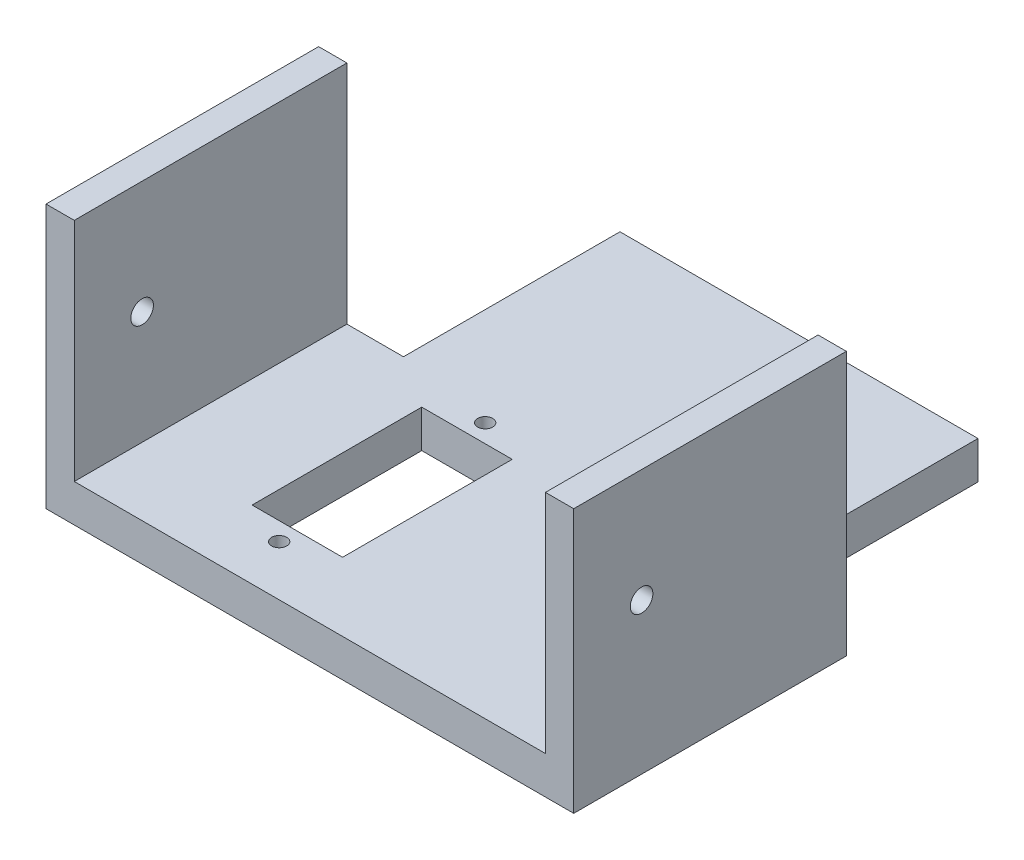
ISO-10303-21;
HEADER;
FILE_DESCRIPTION(('STEP AP214'),'2;1');
FILE_NAME('part.step','',(''),(''),'','','');
FILE_SCHEMA(('AUTOMOTIVE_DESIGN { 1 0 10303 214 1 1 1 1 }'));
ENDSEC;
DATA;
#1=APPLICATION_CONTEXT('core data for automotive mechanical design processes');
#2=APPLICATION_PROTOCOL_DEFINITION('international standard','automotive_design',2000,#1);
#3=PRODUCT_CONTEXT('',#1,'mechanical');
#4=PRODUCT('Part','Part','',(#3));
#5=PRODUCT_RELATED_PRODUCT_CATEGORY('part','',(#4));
#6=PRODUCT_DEFINITION_FORMATION('','',#4);
#7=PRODUCT_DEFINITION_CONTEXT('part definition',#1,'design');
#8=PRODUCT_DEFINITION('design','',#6,#7);
#9=PRODUCT_DEFINITION_SHAPE('','',#8);
#10=(LENGTH_UNIT() NAMED_UNIT(*) SI_UNIT(.MILLI.,.METRE.));
#11=(NAMED_UNIT(*) PLANE_ANGLE_UNIT() SI_UNIT($,.RADIAN.));
#12=(NAMED_UNIT(*) SI_UNIT($,.STERADIAN.) SOLID_ANGLE_UNIT());
#13=UNCERTAINTY_MEASURE_WITH_UNIT(LENGTH_MEASURE(1.E-05),#10,'distance_accuracy_value','');
#14=(GEOMETRIC_REPRESENTATION_CONTEXT(3) GLOBAL_UNCERTAINTY_ASSIGNED_CONTEXT((#13)) GLOBAL_UNIT_ASSIGNED_CONTEXT((#10,
#11,#12)) REPRESENTATION_CONTEXT('',''));
#15=CARTESIAN_POINT('',(0.,0.,0.));
#16=DIRECTION('',(0.,0.,1.));
#17=DIRECTION('',(1.,0.,0.));
#18=AXIS2_PLACEMENT_3D('',#15,#16,#17);
#19=CARTESIAN_POINT('',(-35.,5.,-75.));
#20=DIRECTION('',(1.,0.,0.));
#21=DIRECTION('',(0.,0.,-1.));
#22=AXIS2_PLACEMENT_3D('',#19,#20,#21);
#23=PLANE('',#22);
#24=CARTESIAN_POINT('',(-35.,20.,6.));
#25=DIRECTION('',(-1.,0.,0.));
#26=DIRECTION('',(0.,0.,1.));
#27=AXIS2_PLACEMENT_3D('',#24,#25,#26);
#28=CIRCLE('',#27,1.5);
#29=CARTESIAN_POINT('',(-35.,20.,7.5));
#30=VERTEX_POINT('',#29);
#31=EDGE_CURVE('E242',#30,#30,#28,.T.);
#32=ORIENTED_EDGE('',*,*,#31,.F.);
#33=EDGE_LOOP('',(#32));
#34=FACE_BOUND('',#33,.T.);
#35=DIRECTION('',(0.,-1.,0.));
#36=VECTOR('',#35,1.);
#37=CARTESIAN_POINT('',(-35.,40.,-21.1622367915147));
#38=LINE('',#37,#36);
#39=CARTESIAN_POINT('',(-35.,35.,-21.1622367915147));
#40=VERTEX_POINT('',#39);
#41=CARTESIAN_POINT('',(-35.,0.,-21.1622367915147));
#42=VERTEX_POINT('',#41);
#43=EDGE_CURVE('E221',#40,#42,#38,.T.);
#44=ORIENTED_EDGE('',*,*,#43,.T.);
#45=DIRECTION('',(0.,0.,1.));
#46=VECTOR('',#45,1.);
#47=CARTESIAN_POINT('',(-35.,0.,-75.));
#48=LINE('',#47,#46);
#49=CARTESIAN_POINT('',(-35.,0.,15.));
#50=VERTEX_POINT('',#49);
#51=EDGE_CURVE('E292',#42,#50,#48,.T.);
#52=ORIENTED_EDGE('',*,*,#51,.T.);
#53=DIRECTION('',(0.,1.,0.));
#54=VECTOR('',#53,1.);
#55=CARTESIAN_POINT('',(-35.,5.,15.));
#56=LINE('',#55,#54);
#57=CARTESIAN_POINT('',(-35.,35.,15.));
#58=VERTEX_POINT('',#57);
#59=EDGE_CURVE('E269',#50,#58,#56,.T.);
#60=ORIENTED_EDGE('',*,*,#59,.T.);
#61=DIRECTION('',(0.,0.,-1.));
#62=VECTOR('',#61,1.);
#63=CARTESIAN_POINT('',(-35.,35.,15.));
#64=LINE('',#63,#62);
#65=EDGE_CURVE('E255',#58,#40,#64,.T.);
#66=ORIENTED_EDGE('',*,*,#65,.T.);
#67=EDGE_LOOP('',(#44,#52,#60,#66));
#68=FACE_BOUND('',#67,.T.);
#69=ADVANCED_FACE('F45',(#34,#68),#23,.F.);
#70=CARTESIAN_POINT('',(-31.25,5.,15.));
#71=DIRECTION('',(1.,0.,0.));
#72=DIRECTION('',(0.,0.,-1.));
#73=AXIS2_PLACEMENT_3D('',#70,#71,#72);
#74=PLANE('',#73);
#75=CARTESIAN_POINT('',(-31.25,20.,6.));
#76=DIRECTION('',(1.,0.,0.));
#77=DIRECTION('',(0.,0.,-1.));
#78=AXIS2_PLACEMENT_3D('',#75,#76,#77);
#79=CIRCLE('',#78,1.5);
#80=CARTESIAN_POINT('',(-31.25,20.,4.5));
#81=VERTEX_POINT('',#80);
#82=EDGE_CURVE('E245',#81,#81,#79,.T.);
#83=ORIENTED_EDGE('',*,*,#82,.F.);
#84=EDGE_LOOP('',(#83));
#85=FACE_BOUND('',#84,.T.);
#86=DIRECTION('',(0.,0.,-1.));
#87=VECTOR('',#86,1.);
#88=CARTESIAN_POINT('',(-31.25,5.,15.));
#89=LINE('',#88,#87);
#90=CARTESIAN_POINT('',(-31.25,5.,15.));
#91=VERTEX_POINT('',#90);
#92=CARTESIAN_POINT('',(-31.25,5.,-21.1622367915147));
#93=VERTEX_POINT('',#92);
#94=EDGE_CURVE('E254',#91,#93,#89,.T.);
#95=ORIENTED_EDGE('',*,*,#94,.T.);
#96=DIRECTION('',(0.,1.,0.));
#97=VECTOR('',#96,1.);
#98=CARTESIAN_POINT('',(-31.25,5.,-21.1622367915147));
#99=LINE('',#98,#97);
#100=CARTESIAN_POINT('',(-31.25,35.,-21.1622367915147));
#101=VERTEX_POINT('',#100);
#102=EDGE_CURVE('E216',#93,#101,#99,.T.);
#103=ORIENTED_EDGE('',*,*,#102,.T.);
#104=DIRECTION('',(0.,0.,-1.));
#105=VECTOR('',#104,1.);
#106=CARTESIAN_POINT('',(-31.25,35.,15.));
#107=LINE('',#106,#105);
#108=CARTESIAN_POINT('',(-31.25,35.,15.));
#109=VERTEX_POINT('',#108);
#110=EDGE_CURVE('E259',#109,#101,#107,.T.);
#111=ORIENTED_EDGE('',*,*,#110,.F.);
#112=DIRECTION('',(0.,-1.,0.));
#113=VECTOR('',#112,1.);
#114=CARTESIAN_POINT('',(-31.25,5.,15.));
#115=LINE('',#114,#113);
#116=EDGE_CURVE('E258',#109,#91,#115,.T.);
#117=ORIENTED_EDGE('',*,*,#116,.T.);
#118=EDGE_LOOP('',(#95,#103,#111,#117));
#119=FACE_BOUND('',#118,.T.);
#120=ADVANCED_FACE('F332',(#85,#119),#74,.T.);
#121=CARTESIAN_POINT('',(-35.,35.,15.));
#122=DIRECTION('',(0.,1.,0.));
#123=DIRECTION('',(0.,0.,1.));
#124=AXIS2_PLACEMENT_3D('',#121,#122,#123);
#125=PLANE('',#124);
#126=ORIENTED_EDGE('',*,*,#110,.T.);
#127=DIRECTION('',(-1.,0.,0.));
#128=VECTOR('',#127,1.);
#129=CARTESIAN_POINT('',(-35.,35.,-21.1622367915147));
#130=LINE('',#129,#128);
#131=EDGE_CURVE('E53',#101,#40,#130,.T.);
#132=ORIENTED_EDGE('',*,*,#131,.T.);
#133=ORIENTED_EDGE('',*,*,#65,.F.);
#134=DIRECTION('',(1.,0.,0.));
#135=VECTOR('',#134,1.);
#136=CARTESIAN_POINT('',(-35.,35.,15.));
#137=LINE('',#136,#135);
#138=EDGE_CURVE('E266',#58,#109,#137,.T.);
#139=ORIENTED_EDGE('',*,*,#138,.T.);
#140=EDGE_LOOP('',(#126,#132,#133,#139));
#141=FACE_BOUND('',#140,.T.);
#142=ADVANCED_FACE('F300',(#141),#125,.T.);
#143=CARTESIAN_POINT('',(0.,5.,0.));
#144=DIRECTION('',(0.,1.,0.));
#145=DIRECTION('',(0.,0.,1.));
#146=AXIS2_PLACEMENT_3D('',#143,#144,#145);
#147=PLANE('',#146);
#148=CARTESIAN_POINT('',(-10.75,5.,-19.));
#149=DIRECTION('',(0.,1.,0.));
#150=DIRECTION('',(0.,0.,1.));
#151=AXIS2_PLACEMENT_3D('',#148,#149,#150);
#152=CIRCLE('',#151,1.);
#153=CARTESIAN_POINT('',(-10.75,5.,-18.));
#154=VERTEX_POINT('',#153);
#155=EDGE_CURVE('E195',#154,#154,#152,.T.);
#156=ORIENTED_EDGE('',*,*,#155,.F.);
#157=EDGE_LOOP('',(#156));
#158=FACE_BOUND('',#157,.T.);
#159=CARTESIAN_POINT('',(-10.75,5.,8.32));
#160=DIRECTION('',(0.,1.,0.));
#161=DIRECTION('',(0.,0.,1.));
#162=AXIS2_PLACEMENT_3D('',#159,#160,#161);
#163=CIRCLE('',#162,0.999999999999999);
#164=CARTESIAN_POINT('',(-10.75,5.,9.32));
#165=VERTEX_POINT('',#164);
#166=EDGE_CURVE('E192',#165,#165,#163,.T.);
#167=ORIENTED_EDGE('',*,*,#166,.F.);
#168=EDGE_LOOP('',(#167));
#169=FACE_BOUND('',#168,.T.);
#170=DIRECTION('',(0.,0.,-1.));
#171=VECTOR('',#170,1.);
#172=CARTESIAN_POINT('',(-4.75,5.,0.));
#173=LINE('',#172,#171);
#174=CARTESIAN_POINT('',(-4.75,5.,5.91));
#175=VERTEX_POINT('',#174);
#176=CARTESIAN_POINT('',(-4.75,5.,-16.59));
#177=VERTEX_POINT('',#176);
#178=EDGE_CURVE('E190',#175,#177,#173,.T.);
#179=ORIENTED_EDGE('',*,*,#178,.F.);
#180=DIRECTION('',(1.,0.,0.));
#181=VECTOR('',#180,1.);
#182=CARTESIAN_POINT('',(0.,5.,5.91));
#183=LINE('',#182,#181);
#184=CARTESIAN_POINT('',(-16.75,5.,5.91));
#185=VERTEX_POINT('',#184);
#186=EDGE_CURVE('E183',#185,#175,#183,.T.);
#187=ORIENTED_EDGE('',*,*,#186,.F.);
#188=DIRECTION('',(0.,0.,1.));
#189=VECTOR('',#188,1.);
#190=CARTESIAN_POINT('',(-16.75,5.,0.));
#191=LINE('',#190,#189);
#192=CARTESIAN_POINT('',(-16.75,5.,-16.59));
#193=VERTEX_POINT('',#192);
#194=EDGE_CURVE('E163',#193,#185,#191,.T.);
#195=ORIENTED_EDGE('',*,*,#194,.F.);
#196=DIRECTION('',(-1.,0.,0.));
#197=VECTOR('',#196,1.);
#198=CARTESIAN_POINT('',(0.,5.,-16.59));
#199=LINE('',#198,#197);
#200=EDGE_CURVE('E188',#177,#193,#199,.T.);
#201=ORIENTED_EDGE('',*,*,#200,.F.);
#202=EDGE_LOOP('',(#179,#187,#195,#201));
#203=FACE_BOUND('',#202,.T.);
#204=DIRECTION('',(1.,0.,0.));
#205=VECTOR('',#204,1.);
#206=CARTESIAN_POINT('',(0.,5.,-21.1622367915147));
#207=LINE('',#206,#205);
#208=CARTESIAN_POINT('',(23.7454943399626,5.,-21.1622367915147));
#209=VERTEX_POINT('',#208);
#210=CARTESIAN_POINT('',(31.25,5.,-21.1622367915147));
#211=VERTEX_POINT('',#210);
#212=EDGE_CURVE('E234',#209,#211,#207,.T.);
#213=ORIENTED_EDGE('',*,*,#212,.F.);
#214=DIRECTION('',(0.,0.,1.));
#215=VECTOR('',#214,1.);
#216=CARTESIAN_POINT('',(23.7454943399626,5.,0.));
#217=LINE('',#216,#215);
#218=CARTESIAN_POINT('',(23.7454943399626,5.,-49.8787477241933));
#219=VERTEX_POINT('',#218);
#220=EDGE_CURVE('E238',#219,#209,#217,.T.);
#221=ORIENTED_EDGE('',*,*,#220,.F.);
#222=DIRECTION('',(1.,0.,0.));
#223=VECTOR('',#222,1.);
#224=CARTESIAN_POINT('',(0.,5.,-49.8787477241933));
#225=LINE('',#224,#223);
#226=CARTESIAN_POINT('',(-23.7454943399626,5.,-49.8787477241933));
#227=VERTEX_POINT('',#226);
#228=EDGE_CURVE('E240',#227,#219,#225,.T.);
#229=ORIENTED_EDGE('',*,*,#228,.F.);
#230=DIRECTION('',(0.,0.,-1.));
#231=VECTOR('',#230,1.);
#232=CARTESIAN_POINT('',(-23.7454943399626,5.,0.));
#233=LINE('',#232,#231);
#234=CARTESIAN_POINT('',(-23.7454943399626,5.,-21.1622367915147));
#235=VERTEX_POINT('',#234);
#236=EDGE_CURVE('E236',#235,#227,#233,.T.);
#237=ORIENTED_EDGE('',*,*,#236,.F.);
#238=DIRECTION('',(-1.,0.,0.));
#239=VECTOR('',#238,1.);
#240=CARTESIAN_POINT('',(0.,5.,-21.1622367915147));
#241=LINE('',#240,#239);
#242=EDGE_CURVE('E229',#235,#93,#241,.T.);
#243=ORIENTED_EDGE('',*,*,#242,.T.);
#244=ORIENTED_EDGE('',*,*,#94,.F.);
#245=DIRECTION('',(1.,0.,0.));
#246=VECTOR('',#245,1.);
#247=CARTESIAN_POINT('',(-40.,5.,15.));
#248=LINE('',#247,#246);
#249=CARTESIAN_POINT('',(31.25,5.,15.));
#250=VERTEX_POINT('',#249);
#251=EDGE_CURVE('E252',#91,#250,#248,.T.);
#252=ORIENTED_EDGE('',*,*,#251,.T.);
#253=DIRECTION('',(0.,0.,-1.));
#254=VECTOR('',#253,1.);
#255=CARTESIAN_POINT('',(31.25,5.,15.));
#256=LINE('',#255,#254);
#257=EDGE_CURVE('E280',#250,#211,#256,.T.);
#258=ORIENTED_EDGE('',*,*,#257,.T.);
#259=EDGE_LOOP('',(#213,#221,#229,#237,#243,#244,#252,#258));
#260=FACE_BOUND('',#259,.T.);
#261=ADVANCED_FACE('F329',(#158,#169,#203,#260),#147,.T.);
#262=CARTESIAN_POINT('',(35.,5.,-75.));
#263=DIRECTION('',(-1.,0.,0.));
#264=DIRECTION('',(0.,0.,1.));
#265=AXIS2_PLACEMENT_3D('',#262,#263,#264);
#266=PLANE('',#265);
#267=CARTESIAN_POINT('',(35.,20.,5.99999999999999));
#268=DIRECTION('',(-1.,0.,0.));
#269=DIRECTION('',(0.,0.,1.));
#270=AXIS2_PLACEMENT_3D('',#267,#268,#269);
#271=CIRCLE('',#270,1.5);
#272=CARTESIAN_POINT('',(35.,20.,7.49999999999999));
#273=VERTEX_POINT('',#272);
#274=EDGE_CURVE('E249',#273,#273,#271,.T.);
#275=ORIENTED_EDGE('',*,*,#274,.T.);
#276=EDGE_LOOP('',(#275));
#277=FACE_BOUND('',#276,.T.);
#278=DIRECTION('',(0.,0.,-1.));
#279=VECTOR('',#278,1.);
#280=CARTESIAN_POINT('',(35.,0.,-75.));
#281=LINE('',#280,#279);
#282=CARTESIAN_POINT('',(35.,0.,15.));
#283=VERTEX_POINT('',#282);
#284=CARTESIAN_POINT('',(35.,0.,-21.1622367915147));
#285=VERTEX_POINT('',#284);
#286=EDGE_CURVE('E284',#283,#285,#281,.T.);
#287=ORIENTED_EDGE('',*,*,#286,.T.);
#288=DIRECTION('',(0.,-1.,0.));
#289=VECTOR('',#288,1.);
#290=CARTESIAN_POINT('',(35.,40.,-21.1622367915147));
#291=LINE('',#290,#289);
#292=CARTESIAN_POINT('',(35.,35.,-21.1622367915147));
#293=VERTEX_POINT('',#292);
#294=EDGE_CURVE('E219',#293,#285,#291,.T.);
#295=ORIENTED_EDGE('',*,*,#294,.F.);
#296=DIRECTION('',(0.,0.,-1.));
#297=VECTOR('',#296,1.);
#298=CARTESIAN_POINT('',(35.,35.,15.));
#299=LINE('',#298,#297);
#300=CARTESIAN_POINT('',(35.,35.,15.));
#301=VERTEX_POINT('',#300);
#302=EDGE_CURVE('E281',#301,#293,#299,.T.);
#303=ORIENTED_EDGE('',*,*,#302,.F.);
#304=DIRECTION('',(0.,-1.,0.));
#305=VECTOR('',#304,1.);
#306=CARTESIAN_POINT('',(35.,5.,15.));
#307=LINE('',#306,#305);
#308=EDGE_CURVE('E272',#301,#283,#307,.T.);
#309=ORIENTED_EDGE('',*,*,#308,.T.);
#310=EDGE_LOOP('',(#287,#295,#303,#309));
#311=FACE_BOUND('',#310,.T.);
#312=ADVANCED_FACE('F47',(#277,#311),#266,.F.);
#313=CARTESIAN_POINT('',(0.,0.,0.));
#314=DIRECTION('',(0.,1.,0.));
#315=DIRECTION('',(0.,0.,1.));
#316=AXIS2_PLACEMENT_3D('',#313,#314,#315);
#317=PLANE('',#316);
#318=CARTESIAN_POINT('',(-10.75,0.,-19.));
#319=DIRECTION('',(0.,-1.,0.));
#320=DIRECTION('',(0.,0.,-1.));
#321=AXIS2_PLACEMENT_3D('',#318,#319,#320);
#322=CIRCLE('',#321,1.);
#323=CARTESIAN_POINT('',(-10.75,0.,-20.));
#324=VERTEX_POINT('',#323);
#325=EDGE_CURVE('E421',#324,#324,#322,.T.);
#326=ORIENTED_EDGE('',*,*,#325,.F.);
#327=EDGE_LOOP('',(#326));
#328=FACE_BOUND('',#327,.T.);
#329=CARTESIAN_POINT('',(-10.75,0.,8.32));
#330=DIRECTION('',(0.,-1.,0.));
#331=DIRECTION('',(0.,0.,-1.));
#332=AXIS2_PLACEMENT_3D('',#329,#330,#331);
#333=CIRCLE('',#332,0.999999999999999);
#334=CARTESIAN_POINT('',(-10.75,0.,7.32));
#335=VERTEX_POINT('',#334);
#336=EDGE_CURVE('E419',#335,#335,#333,.T.);
#337=ORIENTED_EDGE('',*,*,#336,.F.);
#338=EDGE_LOOP('',(#337));
#339=FACE_BOUND('',#338,.T.);
#340=DIRECTION('',(-1.,0.,0.));
#341=VECTOR('',#340,1.);
#342=CARTESIAN_POINT('',(-16.75,0.,5.91));
#343=LINE('',#342,#341);
#344=CARTESIAN_POINT('',(-4.75,0.,5.91));
#345=VERTEX_POINT('',#344);
#346=CARTESIAN_POINT('',(-16.75,0.,5.91));
#347=VERTEX_POINT('',#346);
#348=EDGE_CURVE('E169',#345,#347,#343,.T.);
#349=ORIENTED_EDGE('',*,*,#348,.F.);
#350=DIRECTION('',(0.,0.,1.));
#351=VECTOR('',#350,1.);
#352=CARTESIAN_POINT('',(-4.75,0.,5.91));
#353=LINE('',#352,#351);
#354=CARTESIAN_POINT('',(-4.75,0.,-16.59));
#355=VERTEX_POINT('',#354);
#356=EDGE_CURVE('E68',#355,#345,#353,.T.);
#357=ORIENTED_EDGE('',*,*,#356,.F.);
#358=DIRECTION('',(1.,0.,0.));
#359=VECTOR('',#358,1.);
#360=CARTESIAN_POINT('',(-16.75,0.,-16.59));
#361=LINE('',#360,#359);
#362=CARTESIAN_POINT('',(-16.75,0.,-16.59));
#363=VERTEX_POINT('',#362);
#364=EDGE_CURVE('E176',#363,#355,#361,.T.);
#365=ORIENTED_EDGE('',*,*,#364,.F.);
#366=DIRECTION('',(0.,0.,-1.));
#367=VECTOR('',#366,1.);
#368=CARTESIAN_POINT('',(-16.75,0.,5.91));
#369=LINE('',#368,#367);
#370=EDGE_CURVE('E160',#347,#363,#369,.T.);
#371=ORIENTED_EDGE('',*,*,#370,.F.);
#372=EDGE_LOOP('',(#349,#357,#365,#371));
#373=FACE_BOUND('',#372,.T.);
#374=DIRECTION('',(0.,0.,-1.));
#375=VECTOR('',#374,1.);
#376=CARTESIAN_POINT('',(23.7454943399626,0.,0.));
#377=LINE('',#376,#375);
#378=CARTESIAN_POINT('',(23.7454943399626,0.,-21.1622367915147));
#379=VERTEX_POINT('',#378);
#380=CARTESIAN_POINT('',(23.7454943399626,0.,-49.8787477241933));
#381=VERTEX_POINT('',#380);
#382=EDGE_CURVE('E210',#379,#381,#377,.T.);
#383=ORIENTED_EDGE('',*,*,#382,.F.);
#384=DIRECTION('',(-1.,0.,0.));
#385=VECTOR('',#384,1.);
#386=CARTESIAN_POINT('',(0.,0.,-21.1622367915147));
#387=LINE('',#386,#385);
#388=EDGE_CURVE('E207',#285,#379,#387,.T.);
#389=ORIENTED_EDGE('',*,*,#388,.F.);
#390=ORIENTED_EDGE('',*,*,#286,.F.);
#391=DIRECTION('',(-1.,0.,0.));
#392=VECTOR('',#391,1.);
#393=CARTESIAN_POINT('',(0.,0.,15.));
#394=LINE('',#393,#392);
#395=EDGE_CURVE('E294',#283,#50,#394,.T.);
#396=ORIENTED_EDGE('',*,*,#395,.T.);
#397=ORIENTED_EDGE('',*,*,#51,.F.);
#398=DIRECTION('',(1.,0.,0.));
#399=VECTOR('',#398,1.);
#400=CARTESIAN_POINT('',(0.,0.,-21.1622367915147));
#401=LINE('',#400,#399);
#402=CARTESIAN_POINT('',(-23.7454943399626,0.,-21.1622367915147));
#403=VERTEX_POINT('',#402);
#404=EDGE_CURVE('E204',#42,#403,#401,.T.);
#405=ORIENTED_EDGE('',*,*,#404,.T.);
#406=DIRECTION('',(0.,0.,1.));
#407=VECTOR('',#406,1.);
#408=CARTESIAN_POINT('',(-23.7454943399626,0.,0.));
#409=LINE('',#408,#407);
#410=CARTESIAN_POINT('',(-23.7454943399626,0.,-49.8787477241933));
#411=VERTEX_POINT('',#410);
#412=EDGE_CURVE('E201',#411,#403,#409,.T.);
#413=ORIENTED_EDGE('',*,*,#412,.F.);
#414=DIRECTION('',(-1.,0.,0.));
#415=VECTOR('',#414,1.);
#416=CARTESIAN_POINT('',(0.,0.,-49.8787477241933));
#417=LINE('',#416,#415);
#418=EDGE_CURVE('E198',#381,#411,#417,.T.);
#419=ORIENTED_EDGE('',*,*,#418,.F.);
#420=EDGE_LOOP('',(#383,#389,#390,#396,#397,#405,#413,#419));
#421=FACE_BOUND('',#420,.T.);
#422=ADVANCED_FACE('F173',(#328,#339,#373,#421),#317,.F.);
#423=CARTESIAN_POINT('',(35.,35.,15.));
#424=DIRECTION('',(0.,1.,0.));
#425=DIRECTION('',(0.,0.,1.));
#426=AXIS2_PLACEMENT_3D('',#423,#424,#425);
#427=PLANE('',#426);
#428=DIRECTION('',(1.,0.,0.));
#429=VECTOR('',#428,1.);
#430=CARTESIAN_POINT('',(35.,35.,-21.1622367915147));
#431=LINE('',#430,#429);
#432=CARTESIAN_POINT('',(31.25,35.,-21.1622367915147));
#433=VERTEX_POINT('',#432);
#434=EDGE_CURVE('E232',#433,#293,#431,.T.);
#435=ORIENTED_EDGE('',*,*,#434,.F.);
#436=DIRECTION('',(0.,0.,-1.));
#437=VECTOR('',#436,1.);
#438=CARTESIAN_POINT('',(31.25,35.,15.));
#439=LINE('',#438,#437);
#440=CARTESIAN_POINT('',(31.25,35.,15.));
#441=VERTEX_POINT('',#440);
#442=EDGE_CURVE('E285',#441,#433,#439,.T.);
#443=ORIENTED_EDGE('',*,*,#442,.F.);
#444=DIRECTION('',(1.,0.,0.));
#445=VECTOR('',#444,1.);
#446=CARTESIAN_POINT('',(35.,35.,15.));
#447=LINE('',#446,#445);
#448=EDGE_CURVE('E277',#441,#301,#447,.T.);
#449=ORIENTED_EDGE('',*,*,#448,.T.);
#450=ORIENTED_EDGE('',*,*,#302,.T.);
#451=EDGE_LOOP('',(#435,#443,#449,#450));
#452=FACE_BOUND('',#451,.T.);
#453=ADVANCED_FACE('F320',(#452),#427,.T.);
#454=CARTESIAN_POINT('',(31.25,5.,15.));
#455=DIRECTION('',(-1.,0.,0.));
#456=DIRECTION('',(0.,0.,1.));
#457=AXIS2_PLACEMENT_3D('',#454,#455,#456);
#458=PLANE('',#457);
#459=DIRECTION('',(0.,1.,0.));
#460=VECTOR('',#459,1.);
#461=CARTESIAN_POINT('',(31.25,5.,-21.1622367915147));
#462=LINE('',#461,#460);
#463=EDGE_CURVE('E11',#211,#433,#462,.T.);
#464=ORIENTED_EDGE('',*,*,#463,.F.);
#465=ORIENTED_EDGE('',*,*,#257,.F.);
#466=DIRECTION('',(0.,1.,0.));
#467=VECTOR('',#466,1.);
#468=CARTESIAN_POINT('',(31.25,5.,15.));
#469=LINE('',#468,#467);
#470=EDGE_CURVE('E274',#250,#441,#469,.T.);
#471=ORIENTED_EDGE('',*,*,#470,.T.);
#472=ORIENTED_EDGE('',*,*,#442,.T.);
#473=EDGE_LOOP('',(#464,#465,#471,#472));
#474=FACE_BOUND('',#473,.T.);
#475=CARTESIAN_POINT('',(31.25,20.,5.99999999999999));
#476=DIRECTION('',(-1.,0.,0.));
#477=DIRECTION('',(0.,0.,1.));
#478=AXIS2_PLACEMENT_3D('',#475,#476,#477);
#479=CIRCLE('',#478,1.5);
#480=CARTESIAN_POINT('',(31.25,20.,7.49999999999999));
#481=VERTEX_POINT('',#480);
#482=EDGE_CURVE('E246',#481,#481,#479,.T.);
#483=ORIENTED_EDGE('',*,*,#482,.F.);
#484=EDGE_LOOP('',(#483));
#485=FACE_BOUND('',#484,.T.);
#486=ADVANCED_FACE('F324',(#474,#485),#458,.T.);
#487=CARTESIAN_POINT('',(0.,0.,15.));
#488=DIRECTION('',(0.,0.,1.));
#489=DIRECTION('',(1.,0.,0.));
#490=AXIS2_PLACEMENT_3D('',#487,#488,#489);
#491=PLANE('',#490);
#492=ORIENTED_EDGE('',*,*,#308,.F.);
#493=ORIENTED_EDGE('',*,*,#448,.F.);
#494=ORIENTED_EDGE('',*,*,#470,.F.);
#495=ORIENTED_EDGE('',*,*,#251,.F.);
#496=ORIENTED_EDGE('',*,*,#116,.F.);
#497=ORIENTED_EDGE('',*,*,#138,.F.);
#498=ORIENTED_EDGE('',*,*,#59,.F.);
#499=ORIENTED_EDGE('',*,*,#395,.F.);
#500=EDGE_LOOP('',(#492,#493,#494,#495,#496,#497,#498,#499));
#501=FACE_BOUND('',#500,.T.);
#502=ADVANCED_FACE('F309',(#501),#491,.T.);
#503=CARTESIAN_POINT('',(40.,20.,5.99999999999999));
#504=DIRECTION('',(-1.,0.,0.));
#505=DIRECTION('',(0.,0.,1.));
#506=AXIS2_PLACEMENT_3D('',#503,#504,#505);
#507=CYLINDRICAL_SURFACE('',#506,1.5);
#508=ORIENTED_EDGE('',*,*,#82,.T.);
#509=EDGE_LOOP('',(#508));
#510=FACE_BOUND('',#509,.T.);
#511=ORIENTED_EDGE('',*,*,#31,.T.);
#512=EDGE_LOOP('',(#511));
#513=FACE_BOUND('',#512,.T.);
#514=ADVANCED_FACE('F379',(#510,#513),#507,.F.);
#515=ORIENTED_EDGE('',*,*,#482,.T.);
#516=EDGE_LOOP('',(#515));
#517=FACE_BOUND('',#516,.T.);
#518=ORIENTED_EDGE('',*,*,#274,.F.);
#519=EDGE_LOOP('',(#518));
#520=FACE_BOUND('',#519,.T.);
#521=ADVANCED_FACE('F385',(#517,#520),#507,.F.);
#522=CARTESIAN_POINT('',(0.,40.,-49.8787477241933));
#523=DIRECTION('',(0.,0.,1.));
#524=DIRECTION('',(1.,0.,0.));
#525=AXIS2_PLACEMENT_3D('',#522,#523,#524);
#526=PLANE('',#525);
#527=ORIENTED_EDGE('',*,*,#228,.T.);
#528=DIRECTION('',(0.,-1.,0.));
#529=VECTOR('',#528,1.);
#530=CARTESIAN_POINT('',(23.7454943399626,40.,-49.8787477241933));
#531=LINE('',#530,#529);
#532=EDGE_CURVE('E214',#219,#381,#531,.T.);
#533=ORIENTED_EDGE('',*,*,#532,.T.);
#534=ORIENTED_EDGE('',*,*,#418,.T.);
#535=DIRECTION('',(0.,-1.,0.));
#536=VECTOR('',#535,1.);
#537=CARTESIAN_POINT('',(-23.7454943399626,40.,-49.8787477241933));
#538=LINE('',#537,#536);
#539=EDGE_CURVE('E213',#227,#411,#538,.T.);
#540=ORIENTED_EDGE('',*,*,#539,.F.);
#541=EDGE_LOOP('',(#527,#533,#534,#540));
#542=FACE_BOUND('',#541,.T.);
#543=ADVANCED_FACE('F343',(#542),#526,.F.);
#544=CARTESIAN_POINT('',(23.7454943399626,40.,0.));
#545=DIRECTION('',(-1.,0.,0.));
#546=DIRECTION('',(0.,0.,1.));
#547=AXIS2_PLACEMENT_3D('',#544,#545,#546);
#548=PLANE('',#547);
#549=ORIENTED_EDGE('',*,*,#220,.T.);
#550=DIRECTION('',(0.,-1.,0.));
#551=VECTOR('',#550,1.);
#552=CARTESIAN_POINT('',(23.7454943399626,40.,-21.1622367915147));
#553=LINE('',#552,#551);
#554=EDGE_CURVE('E217',#209,#379,#553,.T.);
#555=ORIENTED_EDGE('',*,*,#554,.T.);
#556=ORIENTED_EDGE('',*,*,#382,.T.);
#557=ORIENTED_EDGE('',*,*,#532,.F.);
#558=EDGE_LOOP('',(#549,#555,#556,#557));
#559=FACE_BOUND('',#558,.T.);
#560=ADVANCED_FACE('F345',(#559),#548,.F.);
#561=CARTESIAN_POINT('',(0.,40.,-21.1622367915147));
#562=DIRECTION('',(0.,0.,1.));
#563=DIRECTION('',(1.,0.,0.));
#564=AXIS2_PLACEMENT_3D('',#561,#562,#563);
#565=PLANE('',#564);
#566=ORIENTED_EDGE('',*,*,#212,.T.);
#567=ORIENTED_EDGE('',*,*,#463,.T.);
#568=ORIENTED_EDGE('',*,*,#434,.T.);
#569=ORIENTED_EDGE('',*,*,#294,.T.);
#570=ORIENTED_EDGE('',*,*,#388,.T.);
#571=ORIENTED_EDGE('',*,*,#554,.F.);
#572=EDGE_LOOP('',(#566,#567,#568,#569,#570,#571));
#573=FACE_BOUND('',#572,.T.);
#574=ADVANCED_FACE('F349',(#573),#565,.F.);
#575=CARTESIAN_POINT('',(0.,40.,-21.1622367915147));
#576=DIRECTION('',(0.,0.,-1.));
#577=DIRECTION('',(-1.,0.,0.));
#578=AXIS2_PLACEMENT_3D('',#575,#576,#577);
#579=PLANE('',#578);
#580=DIRECTION('',(0.,-1.,0.));
#581=VECTOR('',#580,1.);
#582=CARTESIAN_POINT('',(-23.7454943399626,40.,-21.1622367915147));
#583=LINE('',#582,#581);
#584=EDGE_CURVE('E224',#235,#403,#583,.T.);
#585=ORIENTED_EDGE('',*,*,#584,.T.);
#586=ORIENTED_EDGE('',*,*,#404,.F.);
#587=ORIENTED_EDGE('',*,*,#43,.F.);
#588=ORIENTED_EDGE('',*,*,#131,.F.);
#589=ORIENTED_EDGE('',*,*,#102,.F.);
#590=ORIENTED_EDGE('',*,*,#242,.F.);
#591=EDGE_LOOP('',(#585,#586,#587,#588,#589,#590));
#592=FACE_BOUND('',#591,.T.);
#593=ADVANCED_FACE('F333',(#592),#579,.T.);
#594=CARTESIAN_POINT('',(-23.7454943399626,40.,0.));
#595=DIRECTION('',(1.,0.,0.));
#596=DIRECTION('',(0.,0.,-1.));
#597=AXIS2_PLACEMENT_3D('',#594,#595,#596);
#598=PLANE('',#597);
#599=ORIENTED_EDGE('',*,*,#236,.T.);
#600=ORIENTED_EDGE('',*,*,#539,.T.);
#601=ORIENTED_EDGE('',*,*,#412,.T.);
#602=ORIENTED_EDGE('',*,*,#584,.F.);
#603=EDGE_LOOP('',(#599,#600,#601,#602));
#604=FACE_BOUND('',#603,.T.);
#605=ADVANCED_FACE('F336',(#604),#598,.F.);
#606=CARTESIAN_POINT('',(-4.75,35.,5.91));
#607=DIRECTION('',(1.,0.,0.));
#608=DIRECTION('',(0.,0.,-1.));
#609=AXIS2_PLACEMENT_3D('',#606,#607,#608);
#610=PLANE('',#609);
#611=ORIENTED_EDGE('',*,*,#178,.T.);
#612=DIRECTION('',(0.,-1.,0.));
#613=VECTOR('',#612,1.);
#614=CARTESIAN_POINT('',(-4.75,35.,-16.59));
#615=LINE('',#614,#613);
#616=EDGE_CURVE('E181',#177,#355,#615,.T.);
#617=ORIENTED_EDGE('',*,*,#616,.T.);
#618=ORIENTED_EDGE('',*,*,#356,.T.);
#619=DIRECTION('',(0.,-1.,0.));
#620=VECTOR('',#619,1.);
#621=CARTESIAN_POINT('',(-4.75,35.,5.91));
#622=LINE('',#621,#620);
#623=EDGE_CURVE('E166',#175,#345,#622,.T.);
#624=ORIENTED_EDGE('',*,*,#623,.F.);
#625=EDGE_LOOP('',(#611,#617,#618,#624));
#626=FACE_BOUND('',#625,.T.);
#627=ADVANCED_FACE('F390',(#626),#610,.F.);
#628=CARTESIAN_POINT('',(-16.75,35.,-16.59));
#629=DIRECTION('',(0.,0.,-1.));
#630=DIRECTION('',(-1.,0.,0.));
#631=AXIS2_PLACEMENT_3D('',#628,#629,#630);
#632=PLANE('',#631);
#633=ORIENTED_EDGE('',*,*,#200,.T.);
#634=DIRECTION('',(0.,-1.,0.));
#635=VECTOR('',#634,1.);
#636=CARTESIAN_POINT('',(-16.75,35.,-16.59));
#637=LINE('',#636,#635);
#638=EDGE_CURVE('E165',#193,#363,#637,.T.);
#639=ORIENTED_EDGE('',*,*,#638,.T.);
#640=ORIENTED_EDGE('',*,*,#364,.T.);
#641=ORIENTED_EDGE('',*,*,#616,.F.);
#642=EDGE_LOOP('',(#633,#639,#640,#641));
#643=FACE_BOUND('',#642,.T.);
#644=ADVANCED_FACE('F394',(#643),#632,.F.);
#645=CARTESIAN_POINT('',(-16.75,35.,5.91));
#646=DIRECTION('',(-1.,0.,0.));
#647=DIRECTION('',(0.,0.,1.));
#648=AXIS2_PLACEMENT_3D('',#645,#646,#647);
#649=PLANE('',#648);
#650=ORIENTED_EDGE('',*,*,#194,.T.);
#651=DIRECTION('',(0.,-1.,0.));
#652=VECTOR('',#651,1.);
#653=CARTESIAN_POINT('',(-16.75,35.,5.91));
#654=LINE('',#653,#652);
#655=EDGE_CURVE('E60',#185,#347,#654,.T.);
#656=ORIENTED_EDGE('',*,*,#655,.T.);
#657=ORIENTED_EDGE('',*,*,#370,.T.);
#658=ORIENTED_EDGE('',*,*,#638,.F.);
#659=EDGE_LOOP('',(#650,#656,#657,#658));
#660=FACE_BOUND('',#659,.T.);
#661=ADVANCED_FACE('F157',(#660),#649,.F.);
#662=CARTESIAN_POINT('',(-16.75,35.,5.91));
#663=DIRECTION('',(0.,0.,1.));
#664=DIRECTION('',(1.,0.,0.));
#665=AXIS2_PLACEMENT_3D('',#662,#663,#664);
#666=PLANE('',#665);
#667=ORIENTED_EDGE('',*,*,#186,.T.);
#668=ORIENTED_EDGE('',*,*,#623,.T.);
#669=ORIENTED_EDGE('',*,*,#348,.T.);
#670=ORIENTED_EDGE('',*,*,#655,.F.);
#671=EDGE_LOOP('',(#667,#668,#669,#670));
#672=FACE_BOUND('',#671,.T.);
#673=ADVANCED_FACE('F170',(#672),#666,.F.);
#674=CARTESIAN_POINT('',(-10.75,35.,8.32));
#675=DIRECTION('',(0.,-1.,0.));
#676=DIRECTION('',(0.,0.,-1.));
#677=AXIS2_PLACEMENT_3D('',#674,#675,#676);
#678=CYLINDRICAL_SURFACE('',#677,0.999999999999999);
#679=ORIENTED_EDGE('',*,*,#166,.T.);
#680=EDGE_LOOP('',(#679));
#681=FACE_BOUND('',#680,.T.);
#682=ORIENTED_EDGE('',*,*,#336,.T.);
#683=EDGE_LOOP('',(#682));
#684=FACE_BOUND('',#683,.T.);
#685=ADVANCED_FACE('F404',(#681,#684),#678,.F.);
#686=CARTESIAN_POINT('',(-10.75,35.,-19.));
#687=DIRECTION('',(0.,-1.,0.));
#688=DIRECTION('',(0.,0.,-1.));
#689=AXIS2_PLACEMENT_3D('',#686,#687,#688);
#690=CYLINDRICAL_SURFACE('',#689,1.);
#691=ORIENTED_EDGE('',*,*,#155,.T.);
#692=EDGE_LOOP('',(#691));
#693=FACE_BOUND('',#692,.T.);
#694=ORIENTED_EDGE('',*,*,#325,.T.);
#695=EDGE_LOOP('',(#694));
#696=FACE_BOUND('',#695,.T.);
#697=ADVANCED_FACE('F407',(#693,#696),#690,.F.);
#698=CLOSED_SHELL('',(#69,#120,#142,#261,#312,#422,#453,#486,#502,#514,#521,#543,#560,#574,#593,
#605,#627,#644,#661,#673,#685,#697));
#699=MANIFOLD_SOLID_BREP('B2',#698);
#700=ADVANCED_BREP_SHAPE_REPRESENTATION('',(#18,#699),#14);
#701=SHAPE_DEFINITION_REPRESENTATION(#9,#700);
ENDSEC;
END-ISO-10303-21;
